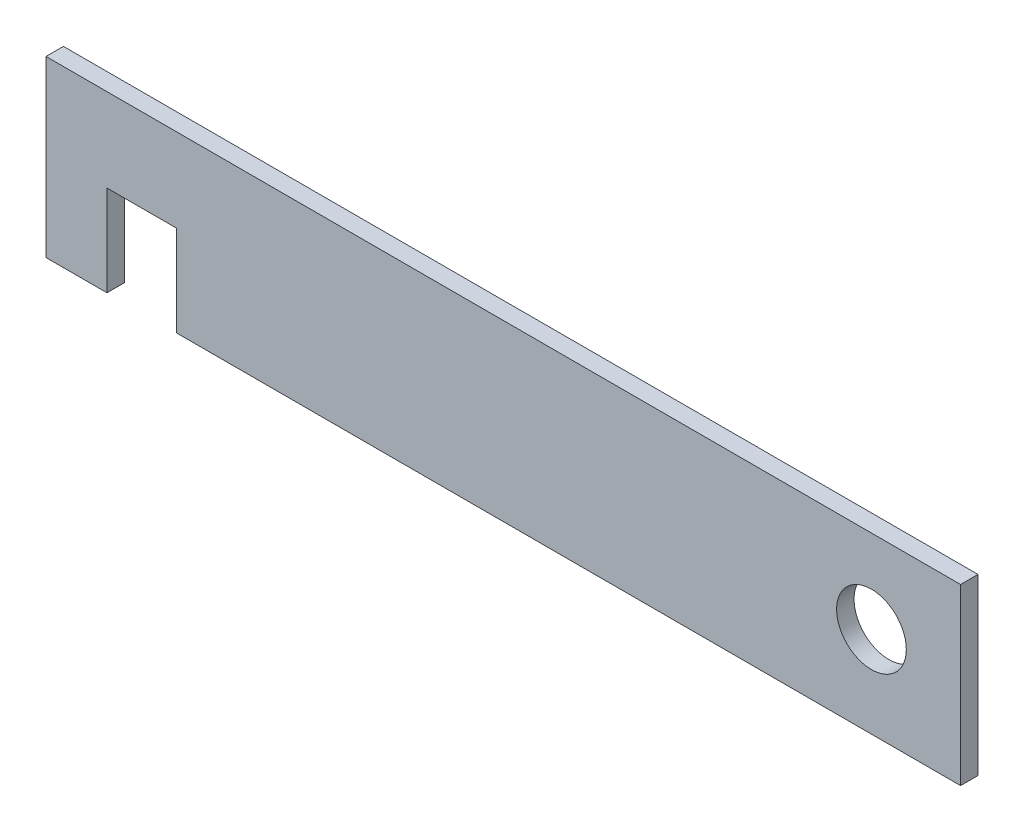
ISO-10303-21;
HEADER;
FILE_DESCRIPTION(('STEP AP214'),'2;1');
FILE_NAME('part.step','',(''),(''),'','','');
FILE_SCHEMA(('AUTOMOTIVE_DESIGN { 1 0 10303 214 1 1 1 1 }'));
ENDSEC;
DATA;
#1=APPLICATION_CONTEXT('core data for automotive mechanical design processes');
#2=APPLICATION_PROTOCOL_DEFINITION('international standard','automotive_design',2000,#1);
#3=PRODUCT_CONTEXT('',#1,'mechanical');
#4=PRODUCT('Part','Part','',(#3));
#5=PRODUCT_RELATED_PRODUCT_CATEGORY('part','',(#4));
#6=PRODUCT_DEFINITION_FORMATION('','',#4);
#7=PRODUCT_DEFINITION_CONTEXT('part definition',#1,'design');
#8=PRODUCT_DEFINITION('design','',#6,#7);
#9=PRODUCT_DEFINITION_SHAPE('','',#8);
#10=(LENGTH_UNIT() NAMED_UNIT(*) SI_UNIT(.MILLI.,.METRE.));
#11=(NAMED_UNIT(*) PLANE_ANGLE_UNIT() SI_UNIT($,.RADIAN.));
#12=(NAMED_UNIT(*) SI_UNIT($,.STERADIAN.) SOLID_ANGLE_UNIT());
#13=UNCERTAINTY_MEASURE_WITH_UNIT(LENGTH_MEASURE(1.E-05),#10,'distance_accuracy_value','');
#14=(GEOMETRIC_REPRESENTATION_CONTEXT(3) GLOBAL_UNCERTAINTY_ASSIGNED_CONTEXT((#13)) GLOBAL_UNIT_ASSIGNED_CONTEXT((#10,
#11,#12)) REPRESENTATION_CONTEXT('',''));
#15=CARTESIAN_POINT('',(0.,0.,0.));
#16=DIRECTION('',(0.,0.,1.));
#17=DIRECTION('',(1.,0.,0.));
#18=AXIS2_PLACEMENT_3D('',#15,#16,#17);
#19=CARTESIAN_POINT('',(0.,0.,10.));
#20=DIRECTION('',(0.,0.,1.));
#21=DIRECTION('',(1.,0.,0.));
#22=AXIS2_PLACEMENT_3D('',#19,#20,#21);
#23=PLANE('',#22);
#24=DIRECTION('',(0.,-1.,0.));
#25=VECTOR('',#24,1.);
#26=CARTESIAN_POINT('',(-262.5,100.,10.));
#27=LINE('',#26,#25);
#28=CARTESIAN_POINT('',(-262.5,100.,10.));
#29=VERTEX_POINT('',#28);
#30=CARTESIAN_POINT('',(-262.5,0.,10.));
#31=VERTEX_POINT('',#30);
#32=EDGE_CURVE('E166',#29,#31,#27,.T.);
#33=ORIENTED_EDGE('',*,*,#32,.T.);
#34=DIRECTION('',(1.,0.,0.));
#35=VECTOR('',#34,1.);
#36=CARTESIAN_POINT('',(-262.5,0.,10.));
#37=LINE('',#36,#35);
#38=CARTESIAN_POINT('',(-227.5,0.,10.));
#39=VERTEX_POINT('',#38);
#40=EDGE_CURVE('E102',#31,#39,#37,.T.);
#41=ORIENTED_EDGE('',*,*,#40,.T.);
#42=DIRECTION('',(0.,1.,0.));
#43=VECTOR('',#42,1.);
#44=CARTESIAN_POINT('',(-227.5,0.,10.));
#45=LINE('',#44,#43);
#46=CARTESIAN_POINT('',(-227.5,52.0874263261297,10.));
#47=VERTEX_POINT('',#46);
#48=EDGE_CURVE('E187',#39,#47,#45,.T.);
#49=ORIENTED_EDGE('',*,*,#48,.T.);
#50=DIRECTION('',(1.,0.,0.));
#51=VECTOR('',#50,1.);
#52=CARTESIAN_POINT('',(-227.5,52.0874263261297,10.));
#53=LINE('',#52,#51);
#54=CARTESIAN_POINT('',(-187.5,52.0874263261297,10.));
#55=VERTEX_POINT('',#54);
#56=EDGE_CURVE('E201',#47,#55,#53,.T.);
#57=ORIENTED_EDGE('',*,*,#56,.T.);
#58=DIRECTION('',(0.,-1.,0.));
#59=VECTOR('',#58,1.);
#60=CARTESIAN_POINT('',(-187.5,52.0874263261297,10.));
#61=LINE('',#60,#59);
#62=CARTESIAN_POINT('',(-187.5,0.,10.));
#63=VERTEX_POINT('',#62);
#64=EDGE_CURVE('E121',#55,#63,#61,.T.);
#65=ORIENTED_EDGE('',*,*,#64,.T.);
#66=DIRECTION('',(1.,0.,0.));
#67=VECTOR('',#66,1.);
#68=CARTESIAN_POINT('',(-187.5,0.,10.));
#69=LINE('',#68,#67);
#70=CARTESIAN_POINT('',(262.5,0.,10.));
#71=VERTEX_POINT('',#70);
#72=EDGE_CURVE('E115',#63,#71,#69,.T.);
#73=ORIENTED_EDGE('',*,*,#72,.T.);
#74=DIRECTION('',(0.,1.,0.));
#75=VECTOR('',#74,1.);
#76=CARTESIAN_POINT('',(262.5,100.,10.));
#77=LINE('',#76,#75);
#78=CARTESIAN_POINT('',(262.5,100.,10.));
#79=VERTEX_POINT('',#78);
#80=EDGE_CURVE('E119',#71,#79,#77,.T.);
#81=ORIENTED_EDGE('',*,*,#80,.T.);
#82=DIRECTION('',(-1.,0.,0.));
#83=VECTOR('',#82,1.);
#84=CARTESIAN_POINT('',(-262.5,100.,10.));
#85=LINE('',#84,#83);
#86=EDGE_CURVE('E59',#79,#29,#85,.T.);
#87=ORIENTED_EDGE('',*,*,#86,.T.);
#88=EDGE_LOOP('',(#33,#41,#49,#57,#65,#73,#81,#87));
#89=FACE_BOUND('',#88,.T.);
#90=CARTESIAN_POINT('',(211.338732731435,52.0874263261297,10.));
#91=DIRECTION('',(0.,0.,1.));
#92=DIRECTION('',(1.,0.,0.));
#93=AXIS2_PLACEMENT_3D('',#90,#91,#92);
#94=CIRCLE('',#93,20.);
#95=CARTESIAN_POINT('',(231.338732731435,52.0874263261297,10.));
#96=VERTEX_POINT('',#95);
#97=EDGE_CURVE('E148',#96,#96,#94,.T.);
#98=ORIENTED_EDGE('',*,*,#97,.F.);
#99=EDGE_LOOP('',(#98));
#100=FACE_BOUND('',#99,.T.);
#101=ADVANCED_FACE('F41',(#89,#100),#23,.T.);
#102=CARTESIAN_POINT('',(0.,0.,0.));
#103=DIRECTION('',(0.,0.,1.));
#104=DIRECTION('',(1.,0.,0.));
#105=AXIS2_PLACEMENT_3D('',#102,#103,#104);
#106=PLANE('',#105);
#107=DIRECTION('',(0.,-1.,0.));
#108=VECTOR('',#107,1.);
#109=CARTESIAN_POINT('',(-262.5,100.,0.));
#110=LINE('',#109,#108);
#111=CARTESIAN_POINT('',(-262.5,100.,0.));
#112=VERTEX_POINT('',#111);
#113=CARTESIAN_POINT('',(-262.5,0.,0.));
#114=VERTEX_POINT('',#113);
#115=EDGE_CURVE('E143',#112,#114,#110,.T.);
#116=ORIENTED_EDGE('',*,*,#115,.F.);
#117=DIRECTION('',(-1.,0.,0.));
#118=VECTOR('',#117,1.);
#119=CARTESIAN_POINT('',(-262.5,100.,0.));
#120=LINE('',#119,#118);
#121=CARTESIAN_POINT('',(262.5,100.,0.));
#122=VERTEX_POINT('',#121);
#123=EDGE_CURVE('E94',#122,#112,#120,.T.);
#124=ORIENTED_EDGE('',*,*,#123,.F.);
#125=DIRECTION('',(0.,1.,0.));
#126=VECTOR('',#125,1.);
#127=CARTESIAN_POINT('',(262.5,100.,0.));
#128=LINE('',#127,#126);
#129=CARTESIAN_POINT('',(262.5,0.,0.));
#130=VERTEX_POINT('',#129);
#131=EDGE_CURVE('E88',#130,#122,#128,.T.);
#132=ORIENTED_EDGE('',*,*,#131,.F.);
#133=DIRECTION('',(1.,0.,0.));
#134=VECTOR('',#133,1.);
#135=CARTESIAN_POINT('',(-187.5,0.,0.));
#136=LINE('',#135,#134);
#137=CARTESIAN_POINT('',(-187.5,0.,0.));
#138=VERTEX_POINT('',#137);
#139=EDGE_CURVE('E130',#138,#130,#136,.T.);
#140=ORIENTED_EDGE('',*,*,#139,.F.);
#141=DIRECTION('',(0.,-1.,0.));
#142=VECTOR('',#141,1.);
#143=CARTESIAN_POINT('',(-187.5,52.0874263261297,0.));
#144=LINE('',#143,#142);
#145=CARTESIAN_POINT('',(-187.5,52.0874263261297,0.));
#146=VERTEX_POINT('',#145);
#147=EDGE_CURVE('E157',#146,#138,#144,.T.);
#148=ORIENTED_EDGE('',*,*,#147,.F.);
#149=DIRECTION('',(1.,0.,0.));
#150=VECTOR('',#149,1.);
#151=CARTESIAN_POINT('',(-227.5,52.0874263261297,0.));
#152=LINE('',#151,#150);
#153=CARTESIAN_POINT('',(-227.5,52.0874263261297,0.));
#154=VERTEX_POINT('',#153);
#155=EDGE_CURVE('E154',#154,#146,#152,.T.);
#156=ORIENTED_EDGE('',*,*,#155,.F.);
#157=DIRECTION('',(0.,1.,0.));
#158=VECTOR('',#157,1.);
#159=CARTESIAN_POINT('',(-227.5,0.,0.));
#160=LINE('',#159,#158);
#161=CARTESIAN_POINT('',(-227.5,0.,0.));
#162=VERTEX_POINT('',#161);
#163=EDGE_CURVE('E151',#162,#154,#160,.T.);
#164=ORIENTED_EDGE('',*,*,#163,.F.);
#165=DIRECTION('',(1.,0.,0.));
#166=VECTOR('',#165,1.);
#167=CARTESIAN_POINT('',(-262.5,0.,0.));
#168=LINE('',#167,#166);
#169=EDGE_CURVE('E147',#114,#162,#168,.T.);
#170=ORIENTED_EDGE('',*,*,#169,.F.);
#171=EDGE_LOOP('',(#116,#124,#132,#140,#148,#156,#164,#170));
#172=FACE_BOUND('',#171,.T.);
#173=CARTESIAN_POINT('',(211.338732731435,52.0874263261297,0.));
#174=DIRECTION('',(0.,0.,1.));
#175=DIRECTION('',(1.,0.,0.));
#176=AXIS2_PLACEMENT_3D('',#173,#174,#175);
#177=CIRCLE('',#176,20.);
#178=CARTESIAN_POINT('',(231.338732731435,52.0874263261297,0.));
#179=VERTEX_POINT('',#178);
#180=EDGE_CURVE('E211',#179,#179,#177,.T.);
#181=ORIENTED_EDGE('',*,*,#180,.T.);
#182=EDGE_LOOP('',(#181));
#183=FACE_BOUND('',#182,.T.);
#184=ADVANCED_FACE('F191',(#172,#183),#106,.F.);
#185=CARTESIAN_POINT('',(-262.5,100.,10.));
#186=DIRECTION('',(1.,0.,0.));
#187=DIRECTION('',(0.,0.,-1.));
#188=AXIS2_PLACEMENT_3D('',#185,#186,#187);
#189=PLANE('',#188);
#190=ORIENTED_EDGE('',*,*,#115,.T.);
#191=DIRECTION('',(0.,0.,-1.));
#192=VECTOR('',#191,1.);
#193=CARTESIAN_POINT('',(-262.5,0.,10.));
#194=LINE('',#193,#192);
#195=EDGE_CURVE('E11',#31,#114,#194,.T.);
#196=ORIENTED_EDGE('',*,*,#195,.F.);
#197=ORIENTED_EDGE('',*,*,#32,.F.);
#198=DIRECTION('',(0.,0.,-1.));
#199=VECTOR('',#198,1.);
#200=CARTESIAN_POINT('',(-262.5,100.,10.));
#201=LINE('',#200,#199);
#202=EDGE_CURVE('E139',#29,#112,#201,.T.);
#203=ORIENTED_EDGE('',*,*,#202,.T.);
#204=EDGE_LOOP('',(#190,#196,#197,#203));
#205=FACE_BOUND('',#204,.T.);
#206=ADVANCED_FACE('F43',(#205),#189,.F.);
#207=CARTESIAN_POINT('',(-262.5,0.,10.));
#208=DIRECTION('',(0.,1.,0.));
#209=DIRECTION('',(0.,0.,1.));
#210=AXIS2_PLACEMENT_3D('',#207,#208,#209);
#211=PLANE('',#210);
#212=ORIENTED_EDGE('',*,*,#169,.T.);
#213=DIRECTION('',(0.,0.,-1.));
#214=VECTOR('',#213,1.);
#215=CARTESIAN_POINT('',(-227.5,0.,10.));
#216=LINE('',#215,#214);
#217=EDGE_CURVE('E51',#39,#162,#216,.T.);
#218=ORIENTED_EDGE('',*,*,#217,.F.);
#219=ORIENTED_EDGE('',*,*,#40,.F.);
#220=ORIENTED_EDGE('',*,*,#195,.T.);
#221=EDGE_LOOP('',(#212,#218,#219,#220));
#222=FACE_BOUND('',#221,.T.);
#223=ADVANCED_FACE('F241',(#222),#211,.F.);
#224=CARTESIAN_POINT('',(-227.5,0.,10.));
#225=DIRECTION('',(-1.,0.,0.));
#226=DIRECTION('',(0.,0.,1.));
#227=AXIS2_PLACEMENT_3D('',#224,#225,#226);
#228=PLANE('',#227);
#229=ORIENTED_EDGE('',*,*,#163,.T.);
#230=DIRECTION('',(0.,0.,-1.));
#231=VECTOR('',#230,1.);
#232=CARTESIAN_POINT('',(-227.5,52.0874263261297,10.));
#233=LINE('',#232,#231);
#234=EDGE_CURVE('E177',#47,#154,#233,.T.);
#235=ORIENTED_EDGE('',*,*,#234,.F.);
#236=ORIENTED_EDGE('',*,*,#48,.F.);
#237=ORIENTED_EDGE('',*,*,#217,.T.);
#238=EDGE_LOOP('',(#229,#235,#236,#237));
#239=FACE_BOUND('',#238,.T.);
#240=ADVANCED_FACE('F185',(#239),#228,.F.);
#241=CARTESIAN_POINT('',(-227.5,52.0874263261297,10.));
#242=DIRECTION('',(0.,1.,0.));
#243=DIRECTION('',(0.,0.,1.));
#244=AXIS2_PLACEMENT_3D('',#241,#242,#243);
#245=PLANE('',#244);
#246=ORIENTED_EDGE('',*,*,#155,.T.);
#247=DIRECTION('',(0.,0.,-1.));
#248=VECTOR('',#247,1.);
#249=CARTESIAN_POINT('',(-187.5,52.0874263261297,10.));
#250=LINE('',#249,#248);
#251=EDGE_CURVE('E173',#55,#146,#250,.T.);
#252=ORIENTED_EDGE('',*,*,#251,.F.);
#253=ORIENTED_EDGE('',*,*,#56,.F.);
#254=ORIENTED_EDGE('',*,*,#234,.T.);
#255=EDGE_LOOP('',(#246,#252,#253,#254));
#256=FACE_BOUND('',#255,.T.);
#257=ADVANCED_FACE('F196',(#256),#245,.F.);
#258=CARTESIAN_POINT('',(-187.5,52.0874263261297,10.));
#259=DIRECTION('',(1.,0.,0.));
#260=DIRECTION('',(0.,0.,-1.));
#261=AXIS2_PLACEMENT_3D('',#258,#259,#260);
#262=PLANE('',#261);
#263=ORIENTED_EDGE('',*,*,#147,.T.);
#264=DIRECTION('',(0.,0.,-1.));
#265=VECTOR('',#264,1.);
#266=CARTESIAN_POINT('',(-187.5,0.,10.));
#267=LINE('',#266,#265);
#268=EDGE_CURVE('E132',#63,#138,#267,.T.);
#269=ORIENTED_EDGE('',*,*,#268,.F.);
#270=ORIENTED_EDGE('',*,*,#64,.F.);
#271=ORIENTED_EDGE('',*,*,#251,.T.);
#272=EDGE_LOOP('',(#263,#269,#270,#271));
#273=FACE_BOUND('',#272,.T.);
#274=ADVANCED_FACE('F199',(#273),#262,.F.);
#275=CARTESIAN_POINT('',(-187.5,0.,10.));
#276=DIRECTION('',(0.,1.,0.));
#277=DIRECTION('',(0.,0.,1.));
#278=AXIS2_PLACEMENT_3D('',#275,#276,#277);
#279=PLANE('',#278);
#280=ORIENTED_EDGE('',*,*,#139,.T.);
#281=DIRECTION('',(0.,0.,-1.));
#282=VECTOR('',#281,1.);
#283=CARTESIAN_POINT('',(262.5,0.,10.));
#284=LINE('',#283,#282);
#285=EDGE_CURVE('E127',#71,#130,#284,.T.);
#286=ORIENTED_EDGE('',*,*,#285,.F.);
#287=ORIENTED_EDGE('',*,*,#72,.F.);
#288=ORIENTED_EDGE('',*,*,#268,.T.);
#289=EDGE_LOOP('',(#280,#286,#287,#288));
#290=FACE_BOUND('',#289,.T.);
#291=ADVANCED_FACE('F128',(#290),#279,.F.);
#292=CARTESIAN_POINT('',(262.5,100.,10.));
#293=DIRECTION('',(-1.,0.,0.));
#294=DIRECTION('',(0.,0.,1.));
#295=AXIS2_PLACEMENT_3D('',#292,#293,#294);
#296=PLANE('',#295);
#297=ORIENTED_EDGE('',*,*,#131,.T.);
#298=DIRECTION('',(0.,0.,-1.));
#299=VECTOR('',#298,1.);
#300=CARTESIAN_POINT('',(262.5,100.,10.));
#301=LINE('',#300,#299);
#302=EDGE_CURVE('E133',#79,#122,#301,.T.);
#303=ORIENTED_EDGE('',*,*,#302,.F.);
#304=ORIENTED_EDGE('',*,*,#80,.F.);
#305=ORIENTED_EDGE('',*,*,#285,.T.);
#306=EDGE_LOOP('',(#297,#303,#304,#305));
#307=FACE_BOUND('',#306,.T.);
#308=ADVANCED_FACE('F135',(#307),#296,.F.);
#309=CARTESIAN_POINT('',(-262.5,100.,10.));
#310=DIRECTION('',(0.,-1.,0.));
#311=DIRECTION('',(0.,0.,-1.));
#312=AXIS2_PLACEMENT_3D('',#309,#310,#311);
#313=PLANE('',#312);
#314=ORIENTED_EDGE('',*,*,#123,.T.);
#315=ORIENTED_EDGE('',*,*,#202,.F.);
#316=ORIENTED_EDGE('',*,*,#86,.F.);
#317=ORIENTED_EDGE('',*,*,#302,.T.);
#318=EDGE_LOOP('',(#314,#315,#316,#317));
#319=FACE_BOUND('',#318,.T.);
#320=ADVANCED_FACE('F229',(#319),#313,.F.);
#321=CARTESIAN_POINT('',(211.338732731435,52.0874263261297,10.));
#322=DIRECTION('',(0.,0.,-1.));
#323=DIRECTION('',(-1.,0.,0.));
#324=AXIS2_PLACEMENT_3D('',#321,#322,#323);
#325=CYLINDRICAL_SURFACE('',#324,20.);
#326=ORIENTED_EDGE('',*,*,#97,.T.);
#327=EDGE_LOOP('',(#326));
#328=FACE_BOUND('',#327,.T.);
#329=ORIENTED_EDGE('',*,*,#180,.F.);
#330=EDGE_LOOP('',(#329));
#331=FACE_BOUND('',#330,.T.);
#332=ADVANCED_FACE('F219',(#328,#331),#325,.F.);
#333=CLOSED_SHELL('',(#101,#184,#206,#223,#240,#257,#274,#291,#308,#320,#332));
#334=MANIFOLD_SOLID_BREP('B2',#333);
#335=ADVANCED_BREP_SHAPE_REPRESENTATION('',(#18,#334),#14);
#336=SHAPE_DEFINITION_REPRESENTATION(#9,#335);
ENDSEC;
END-ISO-10303-21;
